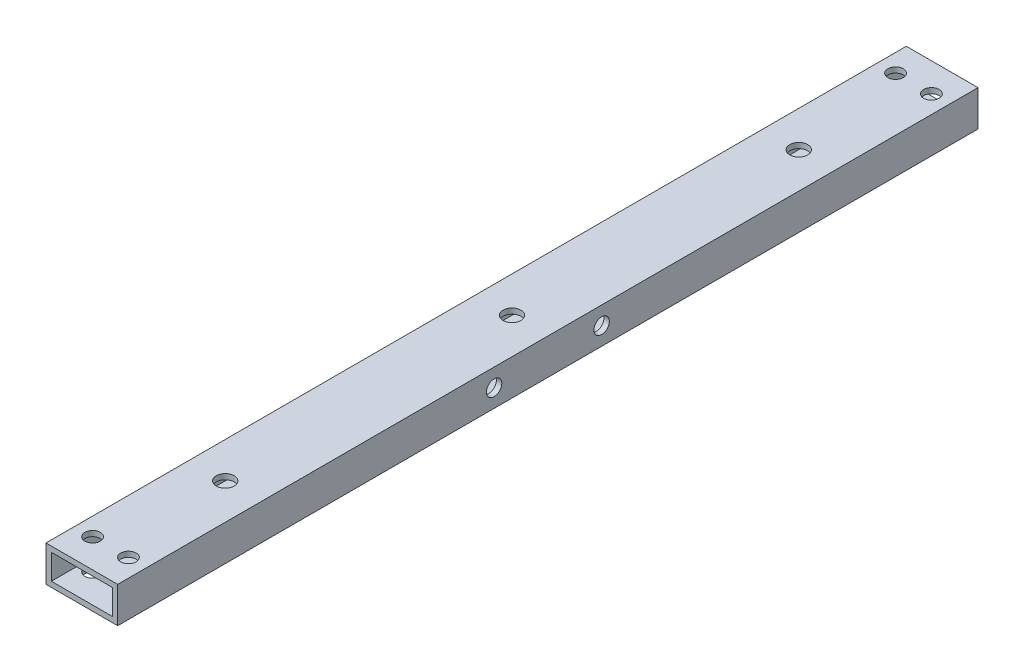
ISO-10303-21;
HEADER;
FILE_DESCRIPTION(('STEP AP214'),'2;1');
FILE_NAME('part.step','',(''),(''),'','','');
FILE_SCHEMA(('AUTOMOTIVE_DESIGN { 1 0 10303 214 1 1 1 1 }'));
ENDSEC;
DATA;
#1=APPLICATION_CONTEXT('core data for automotive mechanical design processes');
#2=APPLICATION_PROTOCOL_DEFINITION('international standard','automotive_design',2000,#1);
#3=PRODUCT_CONTEXT('',#1,'mechanical');
#4=PRODUCT('Part','Part','',(#3));
#5=PRODUCT_RELATED_PRODUCT_CATEGORY('part','',(#4));
#6=PRODUCT_DEFINITION_FORMATION('','',#4);
#7=PRODUCT_DEFINITION_CONTEXT('part definition',#1,'design');
#8=PRODUCT_DEFINITION('design','',#6,#7);
#9=PRODUCT_DEFINITION_SHAPE('','',#8);
#10=(LENGTH_UNIT() NAMED_UNIT(*) SI_UNIT(.MILLI.,.METRE.));
#11=(NAMED_UNIT(*) PLANE_ANGLE_UNIT() SI_UNIT($,.RADIAN.));
#12=(NAMED_UNIT(*) SI_UNIT($,.STERADIAN.) SOLID_ANGLE_UNIT());
#13=UNCERTAINTY_MEASURE_WITH_UNIT(LENGTH_MEASURE(1.E-05),#10,'distance_accuracy_value','');
#14=(GEOMETRIC_REPRESENTATION_CONTEXT(3) GLOBAL_UNCERTAINTY_ASSIGNED_CONTEXT((#13)) GLOBAL_UNIT_ASSIGNED_CONTEXT((#10,
#11,#12)) REPRESENTATION_CONTEXT('',''));
#15=CARTESIAN_POINT('',(0.,0.,0.));
#16=DIRECTION('',(0.,0.,1.));
#17=DIRECTION('',(1.,0.,0.));
#18=AXIS2_PLACEMENT_3D('',#15,#16,#17);
#19=CARTESIAN_POINT('',(0.,0.,240.));
#20=DIRECTION('',(0.,0.,1.));
#21=DIRECTION('',(1.,0.,0.));
#22=AXIS2_PLACEMENT_3D('',#19,#20,#21);
#23=PLANE('',#22);
#24=DIRECTION('',(0.,1.,0.));
#25=VECTOR('',#24,1.);
#26=CARTESIAN_POINT('',(10.,5.,240.));
#27=LINE('',#26,#25);
#28=CARTESIAN_POINT('',(10.,-5.,240.));
#29=VERTEX_POINT('',#28);
#30=CARTESIAN_POINT('',(10.,5.,240.));
#31=VERTEX_POINT('',#30);
#32=EDGE_CURVE('E181',#29,#31,#27,.T.);
#33=ORIENTED_EDGE('',*,*,#32,.T.);
#34=DIRECTION('',(-1.,0.,0.));
#35=VECTOR('',#34,1.);
#36=CARTESIAN_POINT('',(-10.,5.,240.));
#37=LINE('',#36,#35);
#38=CARTESIAN_POINT('',(-10.,5.,240.));
#39=VERTEX_POINT('',#38);
#40=EDGE_CURVE('E185',#31,#39,#37,.T.);
#41=ORIENTED_EDGE('',*,*,#40,.T.);
#42=DIRECTION('',(0.,-1.,0.));
#43=VECTOR('',#42,1.);
#44=CARTESIAN_POINT('',(-10.,5.,240.));
#45=LINE('',#44,#43);
#46=CARTESIAN_POINT('',(-10.,-5.,240.));
#47=VERTEX_POINT('',#46);
#48=EDGE_CURVE('E189',#39,#47,#45,.T.);
#49=ORIENTED_EDGE('',*,*,#48,.T.);
#50=DIRECTION('',(1.,0.,0.));
#51=VECTOR('',#50,1.);
#52=CARTESIAN_POINT('',(-10.,-5.,240.));
#53=LINE('',#52,#51);
#54=EDGE_CURVE('E192',#47,#29,#53,.T.);
#55=ORIENTED_EDGE('',*,*,#54,.T.);
#56=EDGE_LOOP('',(#33,#41,#49,#55));
#57=FACE_BOUND('',#56,.T.);
#58=DIRECTION('',(-1.,0.,0.));
#59=VECTOR('',#58,1.);
#60=CARTESIAN_POINT('',(-10.,3.5,240.));
#61=LINE('',#60,#59);
#62=CARTESIAN_POINT('',(8.5,3.5,240.));
#63=VERTEX_POINT('',#62);
#64=CARTESIAN_POINT('',(-8.5,3.5,240.));
#65=VERTEX_POINT('',#64);
#66=EDGE_CURVE('E140',#63,#65,#61,.T.);
#67=ORIENTED_EDGE('',*,*,#66,.F.);
#68=DIRECTION('',(0.,1.,0.));
#69=VECTOR('',#68,1.);
#70=CARTESIAN_POINT('',(8.5,5.,240.));
#71=LINE('',#70,#69);
#72=CARTESIAN_POINT('',(8.5,-3.5,240.));
#73=VERTEX_POINT('',#72);
#74=EDGE_CURVE('E131',#73,#63,#71,.T.);
#75=ORIENTED_EDGE('',*,*,#74,.F.);
#76=DIRECTION('',(1.,0.,0.));
#77=VECTOR('',#76,1.);
#78=CARTESIAN_POINT('',(-10.,-3.5,240.));
#79=LINE('',#78,#77);
#80=CARTESIAN_POINT('',(-8.5,-3.5,240.));
#81=VERTEX_POINT('',#80);
#82=EDGE_CURVE('E157',#81,#73,#79,.T.);
#83=ORIENTED_EDGE('',*,*,#82,.F.);
#84=DIRECTION('',(0.,-1.,0.));
#85=VECTOR('',#84,1.);
#86=CARTESIAN_POINT('',(-8.5,5.,240.));
#87=LINE('',#86,#85);
#88=EDGE_CURVE('E153',#65,#81,#87,.T.);
#89=ORIENTED_EDGE('',*,*,#88,.F.);
#90=EDGE_LOOP('',(#67,#75,#83,#89));
#91=FACE_BOUND('',#90,.T.);
#92=ADVANCED_FACE('F63',(#57,#91),#23,.T.);
#93=CARTESIAN_POINT('',(0.,0.,0.));
#94=DIRECTION('',(0.,0.,1.));
#95=DIRECTION('',(1.,0.,0.));
#96=AXIS2_PLACEMENT_3D('',#93,#94,#95);
#97=PLANE('',#96);
#98=DIRECTION('',(0.,1.,0.));
#99=VECTOR('',#98,1.);
#100=CARTESIAN_POINT('',(10.,5.,0.));
#101=LINE('',#100,#99);
#102=CARTESIAN_POINT('',(10.,-5.,0.));
#103=VERTEX_POINT('',#102);
#104=CARTESIAN_POINT('',(10.,5.,0.));
#105=VERTEX_POINT('',#104);
#106=EDGE_CURVE('E149',#103,#105,#101,.T.);
#107=ORIENTED_EDGE('',*,*,#106,.F.);
#108=DIRECTION('',(1.,0.,0.));
#109=VECTOR('',#108,1.);
#110=CARTESIAN_POINT('',(-10.,-5.,0.));
#111=LINE('',#110,#109);
#112=CARTESIAN_POINT('',(-10.,-5.,0.));
#113=VERTEX_POINT('',#112);
#114=EDGE_CURVE('E186',#113,#103,#111,.T.);
#115=ORIENTED_EDGE('',*,*,#114,.F.);
#116=DIRECTION('',(0.,-1.,0.));
#117=VECTOR('',#116,1.);
#118=CARTESIAN_POINT('',(-10.,5.,0.));
#119=LINE('',#118,#117);
#120=CARTESIAN_POINT('',(-10.,5.,0.));
#121=VERTEX_POINT('',#120);
#122=EDGE_CURVE('E202',#121,#113,#119,.T.);
#123=ORIENTED_EDGE('',*,*,#122,.F.);
#124=DIRECTION('',(-1.,0.,0.));
#125=VECTOR('',#124,1.);
#126=CARTESIAN_POINT('',(-10.,5.,0.));
#127=LINE('',#126,#125);
#128=EDGE_CURVE('E199',#105,#121,#127,.T.);
#129=ORIENTED_EDGE('',*,*,#128,.F.);
#130=EDGE_LOOP('',(#107,#115,#123,#129));
#131=FACE_BOUND('',#130,.T.);
#132=DIRECTION('',(0.,1.,0.));
#133=VECTOR('',#132,1.);
#134=CARTESIAN_POINT('',(8.5,5.,0.));
#135=LINE('',#134,#133);
#136=CARTESIAN_POINT('',(8.5,-3.5,0.));
#137=VERTEX_POINT('',#136);
#138=CARTESIAN_POINT('',(8.5,3.5,0.));
#139=VERTEX_POINT('',#138);
#140=EDGE_CURVE('E89',#137,#139,#135,.T.);
#141=ORIENTED_EDGE('',*,*,#140,.T.);
#142=DIRECTION('',(-1.,0.,0.));
#143=VECTOR('',#142,1.);
#144=CARTESIAN_POINT('',(-10.,3.5,0.));
#145=LINE('',#144,#143);
#146=CARTESIAN_POINT('',(-8.5,3.5,0.));
#147=VERTEX_POINT('',#146);
#148=EDGE_CURVE('E147',#139,#147,#145,.T.);
#149=ORIENTED_EDGE('',*,*,#148,.T.);
#150=DIRECTION('',(0.,-1.,0.));
#151=VECTOR('',#150,1.);
#152=CARTESIAN_POINT('',(-8.5,5.,0.));
#153=LINE('',#152,#151);
#154=CARTESIAN_POINT('',(-8.5,-3.5,0.));
#155=VERTEX_POINT('',#154);
#156=EDGE_CURVE('E168',#147,#155,#153,.T.);
#157=ORIENTED_EDGE('',*,*,#156,.T.);
#158=DIRECTION('',(1.,0.,0.));
#159=VECTOR('',#158,1.);
#160=CARTESIAN_POINT('',(-10.,-3.5,0.));
#161=LINE('',#160,#159);
#162=EDGE_CURVE('E141',#155,#137,#161,.T.);
#163=ORIENTED_EDGE('',*,*,#162,.T.);
#164=EDGE_LOOP('',(#141,#149,#157,#163));
#165=FACE_BOUND('',#164,.T.);
#166=ADVANCED_FACE('F401',(#131,#165),#97,.F.);
#167=CARTESIAN_POINT('',(10.,5.,240.));
#168=DIRECTION('',(-1.,0.,0.));
#169=DIRECTION('',(0.,-1.,0.));
#170=AXIS2_PLACEMENT_3D('',#167,#168,#169);
#171=PLANE('',#170);
#172=CARTESIAN_POINT('',(10.,0.,105.));
#173=DIRECTION('',(1.,0.,0.));
#174=DIRECTION('',(0.,0.,-1.));
#175=AXIS2_PLACEMENT_3D('',#172,#173,#174);
#176=CIRCLE('',#175,2.15);
#177=CARTESIAN_POINT('',(10.,0.,102.85));
#178=VERTEX_POINT('',#177);
#179=EDGE_CURVE('E263',#178,#178,#176,.T.);
#180=ORIENTED_EDGE('',*,*,#179,.F.);
#181=EDGE_LOOP('',(#180));
#182=FACE_BOUND('',#181,.T.);
#183=CARTESIAN_POINT('',(10.,0.,135.));
#184=DIRECTION('',(1.,0.,0.));
#185=DIRECTION('',(0.,0.,1.));
#186=AXIS2_PLACEMENT_3D('',#183,#184,#185);
#187=CIRCLE('',#186,2.15000000000002);
#188=CARTESIAN_POINT('',(10.,0.,137.15));
#189=VERTEX_POINT('',#188);
#190=EDGE_CURVE('E275',#189,#189,#187,.T.);
#191=ORIENTED_EDGE('',*,*,#190,.F.);
#192=EDGE_LOOP('',(#191));
#193=FACE_BOUND('',#192,.T.);
#194=ORIENTED_EDGE('',*,*,#106,.T.);
#195=DIRECTION('',(0.,0.,-1.));
#196=VECTOR('',#195,1.);
#197=CARTESIAN_POINT('',(10.,5.,240.));
#198=LINE('',#197,#196);
#199=EDGE_CURVE('E12',#31,#105,#198,.T.);
#200=ORIENTED_EDGE('',*,*,#199,.F.);
#201=ORIENTED_EDGE('',*,*,#32,.F.);
#202=DIRECTION('',(0.,0.,-1.));
#203=VECTOR('',#202,1.);
#204=CARTESIAN_POINT('',(10.,-5.,240.));
#205=LINE('',#204,#203);
#206=EDGE_CURVE('E195',#29,#103,#205,.T.);
#207=ORIENTED_EDGE('',*,*,#206,.T.);
#208=EDGE_LOOP('',(#194,#200,#201,#207));
#209=FACE_BOUND('',#208,.T.);
#210=ADVANCED_FACE('F65',(#182,#193,#209),#171,.F.);
#211=CARTESIAN_POINT('',(-10.,5.,240.));
#212=DIRECTION('',(0.,-1.,0.));
#213=DIRECTION('',(0.,0.,-1.));
#214=AXIS2_PLACEMENT_3D('',#211,#212,#213);
#215=PLANE('',#214);
#216=CARTESIAN_POINT('',(0.,5.,40.));
#217=DIRECTION('',(0.,1.,0.));
#218=DIRECTION('',(0.,0.,1.));
#219=AXIS2_PLACEMENT_3D('',#216,#217,#218);
#220=CIRCLE('',#219,2.5);
#221=CARTESIAN_POINT('',(0.,5.,42.5));
#222=VERTEX_POINT('',#221);
#223=EDGE_CURVE('E288',#222,#222,#220,.T.);
#224=ORIENTED_EDGE('',*,*,#223,.F.);
#225=EDGE_LOOP('',(#224));
#226=FACE_BOUND('',#225,.T.);
#227=CARTESIAN_POINT('',(-5.,5.,8.00000000000001));
#228=DIRECTION('',(0.,1.,0.));
#229=DIRECTION('',(0.,0.,1.));
#230=AXIS2_PLACEMENT_3D('',#227,#228,#229);
#231=CIRCLE('',#230,2.15000000000001);
#232=CARTESIAN_POINT('',(-5.,5.,10.15));
#233=VERTEX_POINT('',#232);
#234=EDGE_CURVE('E305',#233,#233,#231,.T.);
#235=ORIENTED_EDGE('',*,*,#234,.F.);
#236=EDGE_LOOP('',(#235));
#237=FACE_BOUND('',#236,.T.);
#238=CARTESIAN_POINT('',(5.,5.,8.00000000000001));
#239=DIRECTION('',(0.,1.,0.));
#240=DIRECTION('',(0.,0.,-1.));
#241=AXIS2_PLACEMENT_3D('',#238,#239,#240);
#242=CIRCLE('',#241,2.15000000000001);
#243=CARTESIAN_POINT('',(5.,5.,5.85));
#244=VERTEX_POINT('',#243);
#245=EDGE_CURVE('E304',#244,#244,#242,.T.);
#246=ORIENTED_EDGE('',*,*,#245,.F.);
#247=EDGE_LOOP('',(#246));
#248=FACE_BOUND('',#247,.T.);
#249=CARTESIAN_POINT('',(-5.,5.,232.));
#250=DIRECTION('',(0.,1.,0.));
#251=DIRECTION('',(0.,0.,-1.));
#252=AXIS2_PLACEMENT_3D('',#249,#250,#251);
#253=CIRCLE('',#252,2.15000000000002);
#254=CARTESIAN_POINT('',(-5.,5.,229.85));
#255=VERTEX_POINT('',#254);
#256=EDGE_CURVE('E321',#255,#255,#253,.T.);
#257=ORIENTED_EDGE('',*,*,#256,.F.);
#258=EDGE_LOOP('',(#257));
#259=FACE_BOUND('',#258,.T.);
#260=CARTESIAN_POINT('',(0.,5.,200.));
#261=DIRECTION('',(0.,1.,0.));
#262=DIRECTION('',(0.,0.,-1.));
#263=AXIS2_PLACEMENT_3D('',#260,#261,#262);
#264=CIRCLE('',#263,2.5);
#265=CARTESIAN_POINT('',(0.,5.,197.5));
#266=VERTEX_POINT('',#265);
#267=EDGE_CURVE('E289',#266,#266,#264,.T.);
#268=ORIENTED_EDGE('',*,*,#267,.F.);
#269=EDGE_LOOP('',(#268));
#270=FACE_BOUND('',#269,.T.);
#271=CARTESIAN_POINT('',(0.,5.,120.));
#272=DIRECTION('',(0.,1.,0.));
#273=DIRECTION('',(0.,0.,1.));
#274=AXIS2_PLACEMENT_3D('',#271,#272,#273);
#275=CIRCLE('',#274,2.5);
#276=CARTESIAN_POINT('',(0.,5.,122.5));
#277=VERTEX_POINT('',#276);
#278=EDGE_CURVE('E283',#277,#277,#275,.T.);
#279=ORIENTED_EDGE('',*,*,#278,.F.);
#280=EDGE_LOOP('',(#279));
#281=FACE_BOUND('',#280,.T.);
#282=CARTESIAN_POINT('',(5.,5.,232.));
#283=DIRECTION('',(0.,1.,0.));
#284=DIRECTION('',(0.,0.,1.));
#285=AXIS2_PLACEMENT_3D('',#282,#283,#284);
#286=CIRCLE('',#285,2.15000000000002);
#287=CARTESIAN_POINT('',(5.,5.,234.15));
#288=VERTEX_POINT('',#287);
#289=EDGE_CURVE('E320',#288,#288,#286,.T.);
#290=ORIENTED_EDGE('',*,*,#289,.F.);
#291=EDGE_LOOP('',(#290));
#292=FACE_BOUND('',#291,.T.);
#293=ORIENTED_EDGE('',*,*,#128,.T.);
#294=DIRECTION('',(0.,0.,-1.));
#295=VECTOR('',#294,1.);
#296=CARTESIAN_POINT('',(-10.,5.,240.));
#297=LINE('',#296,#295);
#298=EDGE_CURVE('E73',#39,#121,#297,.T.);
#299=ORIENTED_EDGE('',*,*,#298,.F.);
#300=ORIENTED_EDGE('',*,*,#40,.F.);
#301=ORIENTED_EDGE('',*,*,#199,.T.);
#302=EDGE_LOOP('',(#293,#299,#300,#301));
#303=FACE_BOUND('',#302,.T.);
#304=ADVANCED_FACE('F387',(#226,#237,#248,#259,#270,#281,#292,#303),#215,.F.);
#305=CARTESIAN_POINT('',(-10.,5.,240.));
#306=DIRECTION('',(1.,0.,0.));
#307=DIRECTION('',(0.,1.,0.));
#308=AXIS2_PLACEMENT_3D('',#305,#306,#307);
#309=PLANE('',#308);
#310=CARTESIAN_POINT('',(-10.,0.,105.));
#311=DIRECTION('',(1.,0.,0.));
#312=DIRECTION('',(0.,0.,-1.));
#313=AXIS2_PLACEMENT_3D('',#310,#311,#312);
#314=CIRCLE('',#313,2.15);
#315=CARTESIAN_POINT('',(-10.,0.,102.85));
#316=VERTEX_POINT('',#315);
#317=EDGE_CURVE('E255',#316,#316,#314,.T.);
#318=ORIENTED_EDGE('',*,*,#317,.T.);
#319=EDGE_LOOP('',(#318));
#320=FACE_BOUND('',#319,.T.);
#321=CARTESIAN_POINT('',(-10.,0.,135.));
#322=DIRECTION('',(1.,0.,0.));
#323=DIRECTION('',(0.,0.,1.));
#324=AXIS2_PLACEMENT_3D('',#321,#322,#323);
#325=CIRCLE('',#324,2.15000000000002);
#326=CARTESIAN_POINT('',(-10.,0.,137.15));
#327=VERTEX_POINT('',#326);
#328=EDGE_CURVE('E269',#327,#327,#325,.T.);
#329=ORIENTED_EDGE('',*,*,#328,.T.);
#330=EDGE_LOOP('',(#329));
#331=FACE_BOUND('',#330,.T.);
#332=ORIENTED_EDGE('',*,*,#122,.T.);
#333=DIRECTION('',(0.,0.,-1.));
#334=VECTOR('',#333,1.);
#335=CARTESIAN_POINT('',(-10.,-5.,240.));
#336=LINE('',#335,#334);
#337=EDGE_CURVE('E210',#47,#113,#336,.T.);
#338=ORIENTED_EDGE('',*,*,#337,.F.);
#339=ORIENTED_EDGE('',*,*,#48,.F.);
#340=ORIENTED_EDGE('',*,*,#298,.T.);
#341=EDGE_LOOP('',(#332,#338,#339,#340));
#342=FACE_BOUND('',#341,.T.);
#343=ADVANCED_FACE('F390',(#320,#331,#342),#309,.F.);
#344=CARTESIAN_POINT('',(-10.,-5.,240.));
#345=DIRECTION('',(0.,1.,0.));
#346=DIRECTION('',(0.,0.,1.));
#347=AXIS2_PLACEMENT_3D('',#344,#345,#346);
#348=PLANE('',#347);
#349=CARTESIAN_POINT('',(0.,-5.,40.));
#350=DIRECTION('',(0.,1.,0.));
#351=DIRECTION('',(0.,0.,1.));
#352=AXIS2_PLACEMENT_3D('',#349,#350,#351);
#353=CIRCLE('',#352,2.5);
#354=CARTESIAN_POINT('',(0.,-5.,42.5));
#355=VERTEX_POINT('',#354);
#356=EDGE_CURVE('E309',#355,#355,#353,.T.);
#357=ORIENTED_EDGE('',*,*,#356,.T.);
#358=EDGE_LOOP('',(#357));
#359=FACE_BOUND('',#358,.T.);
#360=CARTESIAN_POINT('',(-5.,-5.,8.00000000000001));
#361=DIRECTION('',(0.,1.,0.));
#362=DIRECTION('',(0.,0.,1.));
#363=AXIS2_PLACEMENT_3D('',#360,#361,#362);
#364=CIRCLE('',#363,2.15000000000001);
#365=CARTESIAN_POINT('',(-5.,-5.,10.15));
#366=VERTEX_POINT('',#365);
#367=EDGE_CURVE('E300',#366,#366,#364,.T.);
#368=ORIENTED_EDGE('',*,*,#367,.T.);
#369=EDGE_LOOP('',(#368));
#370=FACE_BOUND('',#369,.T.);
#371=CARTESIAN_POINT('',(5.,-5.,8.00000000000001));
#372=DIRECTION('',(0.,1.,0.));
#373=DIRECTION('',(0.,0.,-1.));
#374=AXIS2_PLACEMENT_3D('',#371,#372,#373);
#375=CIRCLE('',#374,2.15000000000001);
#376=CARTESIAN_POINT('',(5.,-5.,5.85));
#377=VERTEX_POINT('',#376);
#378=EDGE_CURVE('E325',#377,#377,#375,.T.);
#379=ORIENTED_EDGE('',*,*,#378,.T.);
#380=EDGE_LOOP('',(#379));
#381=FACE_BOUND('',#380,.T.);
#382=CARTESIAN_POINT('',(-5.,-5.,232.));
#383=DIRECTION('',(0.,1.,0.));
#384=DIRECTION('',(0.,0.,-1.));
#385=AXIS2_PLACEMENT_3D('',#382,#383,#384);
#386=CIRCLE('',#385,2.15000000000002);
#387=CARTESIAN_POINT('',(-5.,-5.,229.85));
#388=VERTEX_POINT('',#387);
#389=EDGE_CURVE('E316',#388,#388,#386,.T.);
#390=ORIENTED_EDGE('',*,*,#389,.T.);
#391=EDGE_LOOP('',(#390));
#392=FACE_BOUND('',#391,.T.);
#393=CARTESIAN_POINT('',(0.,-5.,200.));
#394=DIRECTION('',(0.,1.,0.));
#395=DIRECTION('',(0.,0.,-1.));
#396=AXIS2_PLACEMENT_3D('',#393,#394,#395);
#397=CIRCLE('',#396,2.5);
#398=CARTESIAN_POINT('',(0.,-5.,197.5));
#399=VERTEX_POINT('',#398);
#400=EDGE_CURVE('E284',#399,#399,#397,.T.);
#401=ORIENTED_EDGE('',*,*,#400,.T.);
#402=EDGE_LOOP('',(#401));
#403=FACE_BOUND('',#402,.T.);
#404=CARTESIAN_POINT('',(0.,-5.,120.));
#405=DIRECTION('',(0.,1.,0.));
#406=DIRECTION('',(0.,0.,1.));
#407=AXIS2_PLACEMENT_3D('',#404,#405,#406);
#408=CIRCLE('',#407,2.5);
#409=CARTESIAN_POINT('',(0.,-5.,122.5));
#410=VERTEX_POINT('',#409);
#411=EDGE_CURVE('E293',#410,#410,#408,.T.);
#412=ORIENTED_EDGE('',*,*,#411,.T.);
#413=EDGE_LOOP('',(#412));
#414=FACE_BOUND('',#413,.T.);
#415=CARTESIAN_POINT('',(5.,-5.,232.));
#416=DIRECTION('',(0.,1.,0.));
#417=DIRECTION('',(0.,0.,1.));
#418=AXIS2_PLACEMENT_3D('',#415,#416,#417);
#419=CIRCLE('',#418,2.15000000000002);
#420=CARTESIAN_POINT('',(5.,-5.,234.15));
#421=VERTEX_POINT('',#420);
#422=EDGE_CURVE('E222',#421,#421,#419,.T.);
#423=ORIENTED_EDGE('',*,*,#422,.T.);
#424=EDGE_LOOP('',(#423));
#425=FACE_BOUND('',#424,.T.);
#426=ORIENTED_EDGE('',*,*,#114,.T.);
#427=ORIENTED_EDGE('',*,*,#206,.F.);
#428=ORIENTED_EDGE('',*,*,#54,.F.);
#429=ORIENTED_EDGE('',*,*,#337,.T.);
#430=EDGE_LOOP('',(#426,#427,#428,#429));
#431=FACE_BOUND('',#430,.T.);
#432=ADVANCED_FACE('F405',(#359,#370,#381,#392,#403,#414,#425,#431),#348,.F.);
#433=CARTESIAN_POINT('',(8.5,5.,240.));
#434=DIRECTION('',(-1.,0.,0.));
#435=DIRECTION('',(0.,-1.,0.));
#436=AXIS2_PLACEMENT_3D('',#433,#434,#435);
#437=PLANE('',#436);
#438=CARTESIAN_POINT('',(8.5,0.,105.));
#439=DIRECTION('',(-1.,0.,0.));
#440=DIRECTION('',(0.,-1.,0.));
#441=AXIS2_PLACEMENT_3D('',#438,#439,#440);
#442=CIRCLE('',#441,2.15);
#443=CARTESIAN_POINT('',(8.5,-2.15,105.));
#444=VERTEX_POINT('',#443);
#445=EDGE_CURVE('E279',#444,#444,#442,.T.);
#446=ORIENTED_EDGE('',*,*,#445,.F.);
#447=EDGE_LOOP('',(#446));
#448=FACE_BOUND('',#447,.T.);
#449=CARTESIAN_POINT('',(8.5,0.,135.));
#450=DIRECTION('',(-1.,0.,0.));
#451=DIRECTION('',(0.,-1.,0.));
#452=AXIS2_PLACEMENT_3D('',#449,#450,#451);
#453=CIRCLE('',#452,2.15000000000002);
#454=CARTESIAN_POINT('',(8.5,-2.15000000000002,135.));
#455=VERTEX_POINT('',#454);
#456=EDGE_CURVE('E254',#455,#455,#453,.T.);
#457=ORIENTED_EDGE('',*,*,#456,.F.);
#458=EDGE_LOOP('',(#457));
#459=FACE_BOUND('',#458,.T.);
#460=ORIENTED_EDGE('',*,*,#140,.F.);
#461=DIRECTION('',(0.,0.,-1.));
#462=VECTOR('',#461,1.);
#463=CARTESIAN_POINT('',(8.5,-3.5,240.));
#464=LINE('',#463,#462);
#465=EDGE_CURVE('E135',#73,#137,#464,.T.);
#466=ORIENTED_EDGE('',*,*,#465,.F.);
#467=ORIENTED_EDGE('',*,*,#74,.T.);
#468=DIRECTION('',(0.,0.,-1.));
#469=VECTOR('',#468,1.);
#470=CARTESIAN_POINT('',(8.5,3.5,240.));
#471=LINE('',#470,#469);
#472=EDGE_CURVE('E134',#63,#139,#471,.T.);
#473=ORIENTED_EDGE('',*,*,#472,.T.);
#474=EDGE_LOOP('',(#460,#466,#467,#473));
#475=FACE_BOUND('',#474,.T.);
#476=ADVANCED_FACE('F133',(#448,#459,#475),#437,.T.);
#477=CARTESIAN_POINT('',(-10.,3.5,240.));
#478=DIRECTION('',(0.,-1.,0.));
#479=DIRECTION('',(0.,0.,-1.));
#480=AXIS2_PLACEMENT_3D('',#477,#478,#479);
#481=PLANE('',#480);
#482=CARTESIAN_POINT('',(0.,3.5,40.));
#483=DIRECTION('',(0.,-1.,0.));
#484=DIRECTION('',(0.,0.,-1.));
#485=AXIS2_PLACEMENT_3D('',#482,#483,#484);
#486=CIRCLE('',#485,2.5);
#487=CARTESIAN_POINT('',(0.,3.5,37.5));
#488=VERTEX_POINT('',#487);
#489=EDGE_CURVE('E165',#488,#488,#486,.T.);
#490=ORIENTED_EDGE('',*,*,#489,.F.);
#491=EDGE_LOOP('',(#490));
#492=FACE_BOUND('',#491,.T.);
#493=CARTESIAN_POINT('',(-5.,3.5,8.00000000000001));
#494=DIRECTION('',(0.,-1.,0.));
#495=DIRECTION('',(0.,0.,-1.));
#496=AXIS2_PLACEMENT_3D('',#493,#494,#495);
#497=CIRCLE('',#496,2.15000000000001);
#498=CARTESIAN_POINT('',(-5.,3.5,5.85));
#499=VERTEX_POINT('',#498);
#500=EDGE_CURVE('E247',#499,#499,#497,.T.);
#501=ORIENTED_EDGE('',*,*,#500,.F.);
#502=EDGE_LOOP('',(#501));
#503=FACE_BOUND('',#502,.T.);
#504=CARTESIAN_POINT('',(5.,3.5,8.00000000000001));
#505=DIRECTION('',(0.,-1.,0.));
#506=DIRECTION('',(0.,0.,-1.));
#507=AXIS2_PLACEMENT_3D('',#504,#505,#506);
#508=CIRCLE('',#507,2.15000000000001);
#509=CARTESIAN_POINT('',(5.,3.5,5.85));
#510=VERTEX_POINT('',#509);
#511=EDGE_CURVE('E242',#510,#510,#508,.T.);
#512=ORIENTED_EDGE('',*,*,#511,.F.);
#513=EDGE_LOOP('',(#512));
#514=FACE_BOUND('',#513,.T.);
#515=CARTESIAN_POINT('',(-5.,3.5,232.));
#516=DIRECTION('',(0.,-1.,0.));
#517=DIRECTION('',(0.,0.,-1.));
#518=AXIS2_PLACEMENT_3D('',#515,#516,#517);
#519=CIRCLE('',#518,2.15000000000002);
#520=CARTESIAN_POINT('',(-5.,3.5,229.85));
#521=VERTEX_POINT('',#520);
#522=EDGE_CURVE('E237',#521,#521,#519,.T.);
#523=ORIENTED_EDGE('',*,*,#522,.F.);
#524=EDGE_LOOP('',(#523));
#525=FACE_BOUND('',#524,.T.);
#526=CARTESIAN_POINT('',(0.,3.5,200.));
#527=DIRECTION('',(0.,-1.,0.));
#528=DIRECTION('',(0.,0.,-1.));
#529=AXIS2_PLACEMENT_3D('',#526,#527,#528);
#530=CIRCLE('',#529,2.5);
#531=CARTESIAN_POINT('',(0.,3.5,197.5));
#532=VERTEX_POINT('',#531);
#533=EDGE_CURVE('E232',#532,#532,#530,.T.);
#534=ORIENTED_EDGE('',*,*,#533,.F.);
#535=EDGE_LOOP('',(#534));
#536=FACE_BOUND('',#535,.T.);
#537=CARTESIAN_POINT('',(0.,3.5,120.));
#538=DIRECTION('',(0.,-1.,0.));
#539=DIRECTION('',(0.,0.,-1.));
#540=AXIS2_PLACEMENT_3D('',#537,#538,#539);
#541=CIRCLE('',#540,2.5);
#542=CARTESIAN_POINT('',(0.,3.5,117.5));
#543=VERTEX_POINT('',#542);
#544=EDGE_CURVE('E227',#543,#543,#541,.T.);
#545=ORIENTED_EDGE('',*,*,#544,.F.);
#546=EDGE_LOOP('',(#545));
#547=FACE_BOUND('',#546,.T.);
#548=CARTESIAN_POINT('',(5.,3.5,232.));
#549=DIRECTION('',(0.,-1.,0.));
#550=DIRECTION('',(0.,0.,-1.));
#551=AXIS2_PLACEMENT_3D('',#548,#549,#550);
#552=CIRCLE('',#551,2.15000000000002);
#553=CARTESIAN_POINT('',(5.,3.5,229.85));
#554=VERTEX_POINT('',#553);
#555=EDGE_CURVE('E221',#554,#554,#552,.T.);
#556=ORIENTED_EDGE('',*,*,#555,.F.);
#557=EDGE_LOOP('',(#556));
#558=FACE_BOUND('',#557,.T.);
#559=ORIENTED_EDGE('',*,*,#148,.F.);
#560=ORIENTED_EDGE('',*,*,#472,.F.);
#561=ORIENTED_EDGE('',*,*,#66,.T.);
#562=DIRECTION('',(0.,0.,-1.));
#563=VECTOR('',#562,1.);
#564=CARTESIAN_POINT('',(-8.5,3.5,240.));
#565=LINE('',#564,#563);
#566=EDGE_CURVE('E150',#65,#147,#565,.T.);
#567=ORIENTED_EDGE('',*,*,#566,.T.);
#568=EDGE_LOOP('',(#559,#560,#561,#567));
#569=FACE_BOUND('',#568,.T.);
#570=ADVANCED_FACE('F144',(#492,#503,#514,#525,#536,#547,#558,#569),#481,.T.);
#571=CARTESIAN_POINT('',(-8.5,5.,240.));
#572=DIRECTION('',(1.,0.,0.));
#573=DIRECTION('',(0.,1.,0.));
#574=AXIS2_PLACEMENT_3D('',#571,#572,#573);
#575=PLANE('',#574);
#576=CARTESIAN_POINT('',(-8.5,0.,105.));
#577=DIRECTION('',(1.,0.,0.));
#578=DIRECTION('',(0.,1.,0.));
#579=AXIS2_PLACEMENT_3D('',#576,#577,#578);
#580=CIRCLE('',#579,2.15);
#581=CARTESIAN_POINT('',(-8.5,2.15,105.));
#582=VERTEX_POINT('',#581);
#583=EDGE_CURVE('E67',#582,#582,#580,.T.);
#584=ORIENTED_EDGE('',*,*,#583,.F.);
#585=EDGE_LOOP('',(#584));
#586=FACE_BOUND('',#585,.T.);
#587=CARTESIAN_POINT('',(-8.5,0.,135.));
#588=DIRECTION('',(1.,0.,0.));
#589=DIRECTION('',(0.,1.,0.));
#590=AXIS2_PLACEMENT_3D('',#587,#588,#589);
#591=CIRCLE('',#590,2.15000000000002);
#592=CARTESIAN_POINT('',(-8.5,2.15000000000001,135.));
#593=VERTEX_POINT('',#592);
#594=EDGE_CURVE('E251',#593,#593,#591,.T.);
#595=ORIENTED_EDGE('',*,*,#594,.F.);
#596=EDGE_LOOP('',(#595));
#597=FACE_BOUND('',#596,.T.);
#598=ORIENTED_EDGE('',*,*,#156,.F.);
#599=ORIENTED_EDGE('',*,*,#566,.F.);
#600=ORIENTED_EDGE('',*,*,#88,.T.);
#601=DIRECTION('',(0.,0.,-1.));
#602=VECTOR('',#601,1.);
#603=CARTESIAN_POINT('',(-8.5,-3.5,240.));
#604=LINE('',#603,#602);
#605=EDGE_CURVE('E81',#81,#155,#604,.T.);
#606=ORIENTED_EDGE('',*,*,#605,.T.);
#607=EDGE_LOOP('',(#598,#599,#600,#606));
#608=FACE_BOUND('',#607,.T.);
#609=ADVANCED_FACE('F364',(#586,#597,#608),#575,.T.);
#610=CARTESIAN_POINT('',(-10.,-3.5,240.));
#611=DIRECTION('',(0.,1.,0.));
#612=DIRECTION('',(0.,0.,1.));
#613=AXIS2_PLACEMENT_3D('',#610,#611,#612);
#614=PLANE('',#613);
#615=CARTESIAN_POINT('',(0.,-3.5,40.));
#616=DIRECTION('',(0.,1.,0.));
#617=DIRECTION('',(0.,0.,1.));
#618=AXIS2_PLACEMENT_3D('',#615,#616,#617);
#619=CIRCLE('',#618,2.5);
#620=CARTESIAN_POINT('',(0.,-3.5,42.5));
#621=VERTEX_POINT('',#620);
#622=EDGE_CURVE('E248',#621,#621,#619,.T.);
#623=ORIENTED_EDGE('',*,*,#622,.F.);
#624=EDGE_LOOP('',(#623));
#625=FACE_BOUND('',#624,.T.);
#626=CARTESIAN_POINT('',(-5.,-3.5,8.00000000000001));
#627=DIRECTION('',(0.,1.,0.));
#628=DIRECTION('',(0.,0.,1.));
#629=AXIS2_PLACEMENT_3D('',#626,#627,#628);
#630=CIRCLE('',#629,2.15000000000001);
#631=CARTESIAN_POINT('',(-5.,-3.5,10.15));
#632=VERTEX_POINT('',#631);
#633=EDGE_CURVE('E243',#632,#632,#630,.T.);
#634=ORIENTED_EDGE('',*,*,#633,.F.);
#635=EDGE_LOOP('',(#634));
#636=FACE_BOUND('',#635,.T.);
#637=CARTESIAN_POINT('',(5.,-3.5,8.00000000000001));
#638=DIRECTION('',(0.,1.,0.));
#639=DIRECTION('',(0.,0.,1.));
#640=AXIS2_PLACEMENT_3D('',#637,#638,#639);
#641=CIRCLE('',#640,2.15000000000001);
#642=CARTESIAN_POINT('',(5.,-3.5,10.15));
#643=VERTEX_POINT('',#642);
#644=EDGE_CURVE('E238',#643,#643,#641,.T.);
#645=ORIENTED_EDGE('',*,*,#644,.F.);
#646=EDGE_LOOP('',(#645));
#647=FACE_BOUND('',#646,.T.);
#648=CARTESIAN_POINT('',(-5.,-3.5,232.));
#649=DIRECTION('',(0.,1.,0.));
#650=DIRECTION('',(0.,0.,1.));
#651=AXIS2_PLACEMENT_3D('',#648,#649,#650);
#652=CIRCLE('',#651,2.15000000000002);
#653=CARTESIAN_POINT('',(-5.,-3.5,234.15));
#654=VERTEX_POINT('',#653);
#655=EDGE_CURVE('E233',#654,#654,#652,.T.);
#656=ORIENTED_EDGE('',*,*,#655,.F.);
#657=EDGE_LOOP('',(#656));
#658=FACE_BOUND('',#657,.T.);
#659=CARTESIAN_POINT('',(0.,-3.5,200.));
#660=DIRECTION('',(0.,1.,0.));
#661=DIRECTION('',(0.,0.,1.));
#662=AXIS2_PLACEMENT_3D('',#659,#660,#661);
#663=CIRCLE('',#662,2.5);
#664=CARTESIAN_POINT('',(0.,-3.5,202.5));
#665=VERTEX_POINT('',#664);
#666=EDGE_CURVE('E228',#665,#665,#663,.T.);
#667=ORIENTED_EDGE('',*,*,#666,.F.);
#668=EDGE_LOOP('',(#667));
#669=FACE_BOUND('',#668,.T.);
#670=CARTESIAN_POINT('',(0.,-3.5,120.));
#671=DIRECTION('',(0.,1.,0.));
#672=DIRECTION('',(0.,0.,1.));
#673=AXIS2_PLACEMENT_3D('',#670,#671,#672);
#674=CIRCLE('',#673,2.5);
#675=CARTESIAN_POINT('',(0.,-3.5,122.5));
#676=VERTEX_POINT('',#675);
#677=EDGE_CURVE('E223',#676,#676,#674,.T.);
#678=ORIENTED_EDGE('',*,*,#677,.F.);
#679=EDGE_LOOP('',(#678));
#680=FACE_BOUND('',#679,.T.);
#681=CARTESIAN_POINT('',(5.,-3.5,232.));
#682=DIRECTION('',(0.,1.,0.));
#683=DIRECTION('',(0.,0.,1.));
#684=AXIS2_PLACEMENT_3D('',#681,#682,#683);
#685=CIRCLE('',#684,2.15000000000002);
#686=CARTESIAN_POINT('',(5.,-3.5,234.15));
#687=VERTEX_POINT('',#686);
#688=EDGE_CURVE('E217',#687,#687,#685,.T.);
#689=ORIENTED_EDGE('',*,*,#688,.F.);
#690=EDGE_LOOP('',(#689));
#691=FACE_BOUND('',#690,.T.);
#692=ORIENTED_EDGE('',*,*,#162,.F.);
#693=ORIENTED_EDGE('',*,*,#605,.F.);
#694=ORIENTED_EDGE('',*,*,#82,.T.);
#695=ORIENTED_EDGE('',*,*,#465,.T.);
#696=EDGE_LOOP('',(#692,#693,#694,#695));
#697=FACE_BOUND('',#696,.T.);
#698=ADVANCED_FACE('F489',(#625,#636,#647,#658,#669,#680,#691,#697),#614,.T.);
#699=CARTESIAN_POINT('',(5.,-5.,232.));
#700=DIRECTION('',(0.,1.,0.));
#701=DIRECTION('',(0.,0.,1.));
#702=AXIS2_PLACEMENT_3D('',#699,#700,#701);
#703=CYLINDRICAL_SURFACE('',#702,2.15000000000002);
#704=ORIENTED_EDGE('',*,*,#688,.T.);
#705=EDGE_LOOP('',(#704));
#706=FACE_BOUND('',#705,.T.);
#707=ORIENTED_EDGE('',*,*,#422,.F.);
#708=EDGE_LOOP('',(#707));
#709=FACE_BOUND('',#708,.T.);
#710=ADVANCED_FACE('F384',(#706,#709),#703,.F.);
#711=CARTESIAN_POINT('',(0.,-5.,120.));
#712=DIRECTION('',(0.,1.,0.));
#713=DIRECTION('',(0.,0.,1.));
#714=AXIS2_PLACEMENT_3D('',#711,#712,#713);
#715=CYLINDRICAL_SURFACE('',#714,2.5);
#716=ORIENTED_EDGE('',*,*,#677,.T.);
#717=EDGE_LOOP('',(#716));
#718=FACE_BOUND('',#717,.T.);
#719=ORIENTED_EDGE('',*,*,#411,.F.);
#720=EDGE_LOOP('',(#719));
#721=FACE_BOUND('',#720,.T.);
#722=ADVANCED_FACE('F503',(#718,#721),#715,.F.);
#723=CARTESIAN_POINT('',(0.,-5.,200.));
#724=DIRECTION('',(0.,1.,0.));
#725=DIRECTION('',(0.,0.,1.));
#726=AXIS2_PLACEMENT_3D('',#723,#724,#725);
#727=CYLINDRICAL_SURFACE('',#726,2.5);
#728=ORIENTED_EDGE('',*,*,#666,.T.);
#729=EDGE_LOOP('',(#728));
#730=FACE_BOUND('',#729,.T.);
#731=ORIENTED_EDGE('',*,*,#400,.F.);
#732=EDGE_LOOP('',(#731));
#733=FACE_BOUND('',#732,.T.);
#734=ADVANCED_FACE('F512',(#730,#733),#727,.F.);
#735=CARTESIAN_POINT('',(-5.,-5.,232.));
#736=DIRECTION('',(0.,1.,0.));
#737=DIRECTION('',(0.,0.,1.));
#738=AXIS2_PLACEMENT_3D('',#735,#736,#737);
#739=CYLINDRICAL_SURFACE('',#738,2.15000000000002);
#740=ORIENTED_EDGE('',*,*,#655,.T.);
#741=EDGE_LOOP('',(#740));
#742=FACE_BOUND('',#741,.T.);
#743=ORIENTED_EDGE('',*,*,#389,.F.);
#744=EDGE_LOOP('',(#743));
#745=FACE_BOUND('',#744,.T.);
#746=ADVANCED_FACE('F522',(#742,#745),#739,.F.);
#747=CARTESIAN_POINT('',(5.,-5.,8.00000000000001));
#748=DIRECTION('',(0.,1.,0.));
#749=DIRECTION('',(0.,0.,1.));
#750=AXIS2_PLACEMENT_3D('',#747,#748,#749);
#751=CYLINDRICAL_SURFACE('',#750,2.15000000000001);
#752=ORIENTED_EDGE('',*,*,#644,.T.);
#753=EDGE_LOOP('',(#752));
#754=FACE_BOUND('',#753,.T.);
#755=ORIENTED_EDGE('',*,*,#378,.F.);
#756=EDGE_LOOP('',(#755));
#757=FACE_BOUND('',#756,.T.);
#758=ADVANCED_FACE('F532',(#754,#757),#751,.F.);
#759=CARTESIAN_POINT('',(-5.,-5.,8.00000000000001));
#760=DIRECTION('',(0.,1.,0.));
#761=DIRECTION('',(0.,0.,1.));
#762=AXIS2_PLACEMENT_3D('',#759,#760,#761);
#763=CYLINDRICAL_SURFACE('',#762,2.15000000000001);
#764=ORIENTED_EDGE('',*,*,#633,.T.);
#765=EDGE_LOOP('',(#764));
#766=FACE_BOUND('',#765,.T.);
#767=ORIENTED_EDGE('',*,*,#367,.F.);
#768=EDGE_LOOP('',(#767));
#769=FACE_BOUND('',#768,.T.);
#770=ADVANCED_FACE('F543',(#766,#769),#763,.F.);
#771=CARTESIAN_POINT('',(0.,-5.,40.));
#772=DIRECTION('',(0.,1.,0.));
#773=DIRECTION('',(0.,0.,1.));
#774=AXIS2_PLACEMENT_3D('',#771,#772,#773);
#775=CYLINDRICAL_SURFACE('',#774,2.5);
#776=ORIENTED_EDGE('',*,*,#622,.T.);
#777=EDGE_LOOP('',(#776));
#778=FACE_BOUND('',#777,.T.);
#779=ORIENTED_EDGE('',*,*,#356,.F.);
#780=EDGE_LOOP('',(#779));
#781=FACE_BOUND('',#780,.T.);
#782=ADVANCED_FACE('F382',(#778,#781),#775,.F.);
#783=ORIENTED_EDGE('',*,*,#555,.T.);
#784=EDGE_LOOP('',(#783));
#785=FACE_BOUND('',#784,.T.);
#786=ORIENTED_EDGE('',*,*,#289,.T.);
#787=EDGE_LOOP('',(#786));
#788=FACE_BOUND('',#787,.T.);
#789=ADVANCED_FACE('F378',(#785,#788),#703,.F.);
#790=ORIENTED_EDGE('',*,*,#544,.T.);
#791=EDGE_LOOP('',(#790));
#792=FACE_BOUND('',#791,.T.);
#793=ORIENTED_EDGE('',*,*,#278,.T.);
#794=EDGE_LOOP('',(#793));
#795=FACE_BOUND('',#794,.T.);
#796=ADVANCED_FACE('F381',(#792,#795),#715,.F.);
#797=ORIENTED_EDGE('',*,*,#533,.T.);
#798=EDGE_LOOP('',(#797));
#799=FACE_BOUND('',#798,.T.);
#800=ORIENTED_EDGE('',*,*,#267,.T.);
#801=EDGE_LOOP('',(#800));
#802=FACE_BOUND('',#801,.T.);
#803=ADVANCED_FACE('F524',(#799,#802),#727,.F.);
#804=ORIENTED_EDGE('',*,*,#522,.T.);
#805=EDGE_LOOP('',(#804));
#806=FACE_BOUND('',#805,.T.);
#807=ORIENTED_EDGE('',*,*,#256,.T.);
#808=EDGE_LOOP('',(#807));
#809=FACE_BOUND('',#808,.T.);
#810=ADVANCED_FACE('F535',(#806,#809),#739,.F.);
#811=ORIENTED_EDGE('',*,*,#511,.T.);
#812=EDGE_LOOP('',(#811));
#813=FACE_BOUND('',#812,.T.);
#814=ORIENTED_EDGE('',*,*,#245,.T.);
#815=EDGE_LOOP('',(#814));
#816=FACE_BOUND('',#815,.T.);
#817=ADVANCED_FACE('F546',(#813,#816),#751,.F.);
#818=ORIENTED_EDGE('',*,*,#500,.T.);
#819=EDGE_LOOP('',(#818));
#820=FACE_BOUND('',#819,.T.);
#821=ORIENTED_EDGE('',*,*,#234,.T.);
#822=EDGE_LOOP('',(#821));
#823=FACE_BOUND('',#822,.T.);
#824=ADVANCED_FACE('F439',(#820,#823),#763,.F.);
#825=ORIENTED_EDGE('',*,*,#489,.T.);
#826=EDGE_LOOP('',(#825));
#827=FACE_BOUND('',#826,.T.);
#828=ORIENTED_EDGE('',*,*,#223,.T.);
#829=EDGE_LOOP('',(#828));
#830=FACE_BOUND('',#829,.T.);
#831=ADVANCED_FACE('F359',(#827,#830),#775,.F.);
#832=CARTESIAN_POINT('',(-10.,0.,135.));
#833=DIRECTION('',(1.,0.,0.));
#834=DIRECTION('',(0.,0.,-1.));
#835=AXIS2_PLACEMENT_3D('',#832,#833,#834);
#836=CYLINDRICAL_SURFACE('',#835,2.15000000000002);
#837=ORIENTED_EDGE('',*,*,#594,.T.);
#838=EDGE_LOOP('',(#837));
#839=FACE_BOUND('',#838,.T.);
#840=ORIENTED_EDGE('',*,*,#328,.F.);
#841=EDGE_LOOP('',(#840));
#842=FACE_BOUND('',#841,.T.);
#843=ADVANCED_FACE('F427',(#839,#842),#836,.F.);
#844=CARTESIAN_POINT('',(-10.,0.,105.));
#845=DIRECTION('',(1.,0.,0.));
#846=DIRECTION('',(0.,0.,-1.));
#847=AXIS2_PLACEMENT_3D('',#844,#845,#846);
#848=CYLINDRICAL_SURFACE('',#847,2.15);
#849=ORIENTED_EDGE('',*,*,#583,.T.);
#850=EDGE_LOOP('',(#849));
#851=FACE_BOUND('',#850,.T.);
#852=ORIENTED_EDGE('',*,*,#317,.F.);
#853=EDGE_LOOP('',(#852));
#854=FACE_BOUND('',#853,.T.);
#855=ADVANCED_FACE('F429',(#851,#854),#848,.F.);
#856=ORIENTED_EDGE('',*,*,#456,.T.);
#857=EDGE_LOOP('',(#856));
#858=FACE_BOUND('',#857,.T.);
#859=ORIENTED_EDGE('',*,*,#190,.T.);
#860=EDGE_LOOP('',(#859));
#861=FACE_BOUND('',#860,.T.);
#862=ADVANCED_FACE('F431',(#858,#861),#836,.F.);
#863=ORIENTED_EDGE('',*,*,#445,.T.);
#864=EDGE_LOOP('',(#863));
#865=FACE_BOUND('',#864,.T.);
#866=ORIENTED_EDGE('',*,*,#179,.T.);
#867=EDGE_LOOP('',(#866));
#868=FACE_BOUND('',#867,.T.);
#869=ADVANCED_FACE('F438',(#865,#868),#848,.F.);
#870=CLOSED_SHELL('',(#92,#166,#210,#304,#343,#432,#476,#570,#609,#698,#710,#722,#734,#746,#758,
#770,#782,#789,#796,#803,#810,#817,#824,#831,#843,#855,#862,#869));
#871=MANIFOLD_SOLID_BREP('B2',#870);
#872=ADVANCED_BREP_SHAPE_REPRESENTATION('',(#18,#871),#14);
#873=SHAPE_DEFINITION_REPRESENTATION(#9,#872);
ENDSEC;
END-ISO-10303-21;
